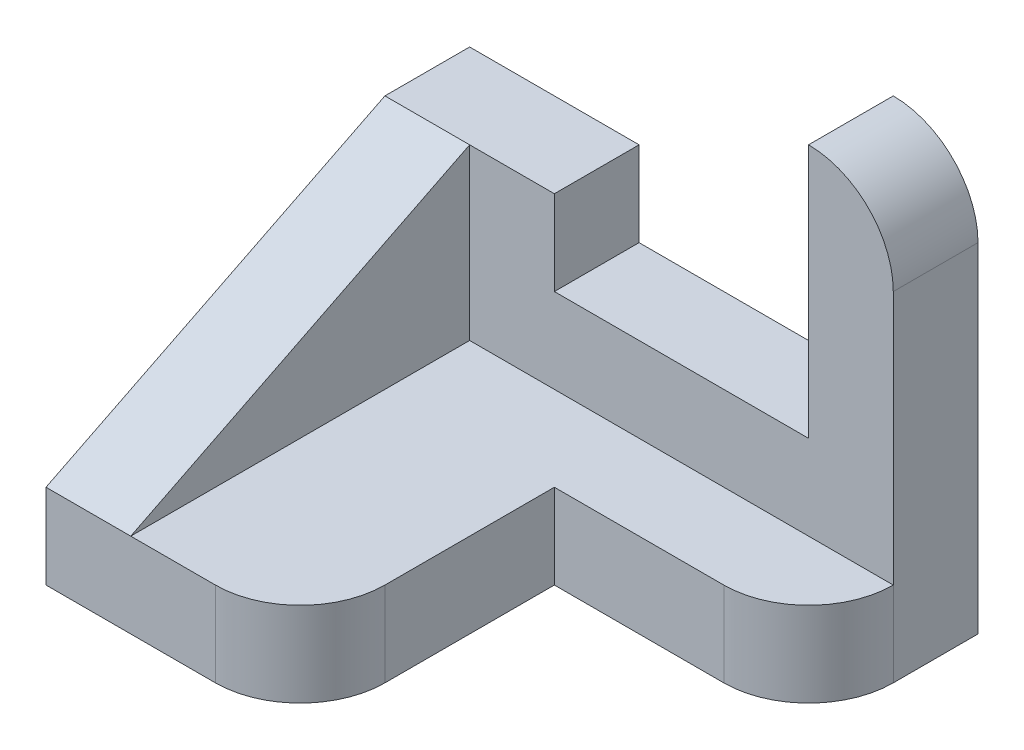
ISO-10303-21;
HEADER;
FILE_DESCRIPTION(('STEP AP214'),'2;1');
FILE_NAME('part.step','',(''),(''),'','','');
FILE_SCHEMA(('AUTOMOTIVE_DESIGN { 1 0 10303 214 1 1 1 1 }'));
ENDSEC;
DATA;
#1=APPLICATION_CONTEXT('core data for automotive mechanical design processes');
#2=APPLICATION_PROTOCOL_DEFINITION('international standard','automotive_design',2000,#1);
#3=PRODUCT_CONTEXT('',#1,'mechanical');
#4=PRODUCT('Part','Part','',(#3));
#5=PRODUCT_RELATED_PRODUCT_CATEGORY('part','',(#4));
#6=PRODUCT_DEFINITION_FORMATION('','',#4);
#7=PRODUCT_DEFINITION_CONTEXT('part definition',#1,'design');
#8=PRODUCT_DEFINITION('design','',#6,#7);
#9=PRODUCT_DEFINITION_SHAPE('','',#8);
#10=(LENGTH_UNIT() NAMED_UNIT(*) SI_UNIT(.MILLI.,.METRE.));
#11=(NAMED_UNIT(*) PLANE_ANGLE_UNIT() SI_UNIT($,.RADIAN.));
#12=(NAMED_UNIT(*) SI_UNIT($,.STERADIAN.) SOLID_ANGLE_UNIT());
#13=UNCERTAINTY_MEASURE_WITH_UNIT(LENGTH_MEASURE(1.E-05),#10,'distance_accuracy_value','');
#14=(GEOMETRIC_REPRESENTATION_CONTEXT(3) GLOBAL_UNCERTAINTY_ASSIGNED_CONTEXT((#13)) GLOBAL_UNIT_ASSIGNED_CONTEXT((#10,
#11,#12)) REPRESENTATION_CONTEXT('',''));
#15=CARTESIAN_POINT('',(0.,0.,0.));
#16=DIRECTION('',(0.,0.,1.));
#17=DIRECTION('',(1.,0.,0.));
#18=AXIS2_PLACEMENT_3D('',#15,#16,#17);
#19=CARTESIAN_POINT('',(-9.99999999999997,10.,15.));
#20=DIRECTION('',(0.,1.,0.));
#21=DIRECTION('',(0.,0.,1.));
#22=AXIS2_PLACEMENT_3D('',#19,#20,#21);
#23=PLANE('',#22);
#24=DIRECTION('',(-1.,0.,0.));
#25=VECTOR('',#24,1.);
#26=CARTESIAN_POINT('',(30.,10.,-15.));
#27=LINE('',#26,#25);
#28=CARTESIAN_POINT('',(30.,10.,-15.));
#29=VERTEX_POINT('',#28);
#30=CARTESIAN_POINT('',(-20.,10.,-15.));
#31=VERTEX_POINT('',#30);
#32=EDGE_CURVE('E185',#29,#31,#27,.T.);
#33=ORIENTED_EDGE('',*,*,#32,.T.);
#34=DIRECTION('',(0.,0.,1.));
#35=VECTOR('',#34,1.);
#36=CARTESIAN_POINT('',(-20.,10.,-15.));
#37=LINE('',#36,#35);
#38=CARTESIAN_POINT('',(-20.,10.,25.));
#39=VERTEX_POINT('',#38);
#40=EDGE_CURVE('E55',#31,#39,#37,.T.);
#41=ORIENTED_EDGE('',*,*,#40,.T.);
#42=DIRECTION('',(1.,0.,0.));
#43=VECTOR('',#42,1.);
#44=CARTESIAN_POINT('',(-30.,10.,25.));
#45=LINE('',#44,#43);
#46=CARTESIAN_POINT('',(-10.,10.,25.));
#47=VERTEX_POINT('',#46);
#48=EDGE_CURVE('E251',#39,#47,#45,.T.);
#49=ORIENTED_EDGE('',*,*,#48,.T.);
#50=CARTESIAN_POINT('',(-9.99999999999997,10.,15.));
#51=DIRECTION('',(0.,1.,0.));
#52=DIRECTION('',(0.,0.,1.));
#53=AXIS2_PLACEMENT_3D('',#50,#51,#52);
#54=CIRCLE('',#53,10.);
#55=CARTESIAN_POINT('',(0.,10.,15.));
#56=VERTEX_POINT('',#55);
#57=EDGE_CURVE('E236',#47,#56,#54,.T.);
#58=ORIENTED_EDGE('',*,*,#57,.T.);
#59=DIRECTION('',(0.,0.,-1.));
#60=VECTOR('',#59,1.);
#61=CARTESIAN_POINT('',(0.,10.,-4.99999999999998));
#62=LINE('',#61,#60);
#63=CARTESIAN_POINT('',(0.,10.,-4.99999999999998));
#64=VERTEX_POINT('',#63);
#65=EDGE_CURVE('E240',#56,#64,#62,.T.);
#66=ORIENTED_EDGE('',*,*,#65,.T.);
#67=DIRECTION('',(1.,0.,0.));
#68=VECTOR('',#67,1.);
#69=CARTESIAN_POINT('',(19.9999999999999,10.,-4.99999999999998));
#70=LINE('',#69,#68);
#71=CARTESIAN_POINT('',(19.9999999999999,10.,-4.99999999999998));
#72=VERTEX_POINT('',#71);
#73=EDGE_CURVE('E244',#64,#72,#70,.T.);
#74=ORIENTED_EDGE('',*,*,#73,.T.);
#75=CARTESIAN_POINT('',(20.,10.,-15.));
#76=DIRECTION('',(0.,1.,0.));
#77=DIRECTION('',(0.,0.,1.));
#78=AXIS2_PLACEMENT_3D('',#75,#76,#77);
#79=CIRCLE('',#78,10.);
#80=EDGE_CURVE('E247',#72,#29,#79,.T.);
#81=ORIENTED_EDGE('',*,*,#80,.T.);
#82=EDGE_LOOP('',(#33,#41,#49,#58,#66,#74,#81));
#83=FACE_BOUND('',#82,.T.);
#84=ADVANCED_FACE('F39',(#83),#23,.T.);
#85=CARTESIAN_POINT('',(20.,40.,-15.));
#86=DIRECTION('',(0.,0.,1.));
#87=DIRECTION('',(1.,0.,0.));
#88=AXIS2_PLACEMENT_3D('',#85,#86,#87);
#89=PLANE('',#88);
#90=DIRECTION('',(-1.,0.,0.));
#91=VECTOR('',#90,1.);
#92=CARTESIAN_POINT('',(-9.99999999999999,30.,-15.));
#93=LINE('',#92,#91);
#94=CARTESIAN_POINT('',(-9.99999999999999,30.,-15.));
#95=VERTEX_POINT('',#94);
#96=CARTESIAN_POINT('',(-20.,30.,-15.));
#97=VERTEX_POINT('',#96);
#98=EDGE_CURVE('E182',#95,#97,#93,.T.);
#99=ORIENTED_EDGE('',*,*,#98,.T.);
#100=DIRECTION('',(0.,-1.,0.));
#101=VECTOR('',#100,1.);
#102=CARTESIAN_POINT('',(-20.,30.,-15.));
#103=LINE('',#102,#101);
#104=EDGE_CURVE('E63',#97,#31,#103,.T.);
#105=ORIENTED_EDGE('',*,*,#104,.T.);
#106=ORIENTED_EDGE('',*,*,#32,.F.);
#107=DIRECTION('',(0.,1.,0.));
#108=VECTOR('',#107,1.);
#109=CARTESIAN_POINT('',(30.,10.,-15.));
#110=LINE('',#109,#108);
#111=CARTESIAN_POINT('',(30.,39.9999999999999,-15.));
#112=VERTEX_POINT('',#111);
#113=EDGE_CURVE('E189',#29,#112,#110,.T.);
#114=ORIENTED_EDGE('',*,*,#113,.T.);
#115=CARTESIAN_POINT('',(20.,40.,-15.));
#116=DIRECTION('',(0.,0.,1.));
#117=DIRECTION('',(1.,0.,0.));
#118=AXIS2_PLACEMENT_3D('',#115,#116,#117);
#119=CIRCLE('',#118,10.);
#120=CARTESIAN_POINT('',(19.9999999999999,50.,-15.));
#121=VERTEX_POINT('',#120);
#122=EDGE_CURVE('E192',#112,#121,#119,.T.);
#123=ORIENTED_EDGE('',*,*,#122,.T.);
#124=DIRECTION('',(0.,1.,0.));
#125=VECTOR('',#124,1.);
#126=CARTESIAN_POINT('',(20.,20.,-15.));
#127=LINE('',#126,#125);
#128=CARTESIAN_POINT('',(20.,20.,-15.));
#129=VERTEX_POINT('',#128);
#130=EDGE_CURVE('E195',#129,#121,#127,.T.);
#131=ORIENTED_EDGE('',*,*,#130,.F.);
#132=DIRECTION('',(-1.,0.,0.));
#133=VECTOR('',#132,1.);
#134=CARTESIAN_POINT('',(20.,20.,-15.));
#135=LINE('',#134,#133);
#136=CARTESIAN_POINT('',(-9.99999999999999,20.,-15.));
#137=VERTEX_POINT('',#136);
#138=EDGE_CURVE('E199',#129,#137,#135,.T.);
#139=ORIENTED_EDGE('',*,*,#138,.T.);
#140=DIRECTION('',(0.,1.,0.));
#141=VECTOR('',#140,1.);
#142=CARTESIAN_POINT('',(-9.99999999999999,20.,-15.));
#143=LINE('',#142,#141);
#144=EDGE_CURVE('E202',#137,#95,#143,.T.);
#145=ORIENTED_EDGE('',*,*,#144,.T.);
#146=EDGE_LOOP('',(#99,#105,#106,#114,#123,#131,#139,#145));
#147=FACE_BOUND('',#146,.T.);
#148=ADVANCED_FACE('F321',(#147),#89,.T.);
#149=CARTESIAN_POINT('',(-9.99999999999997,10.,15.));
#150=DIRECTION('',(0.,-1.,0.));
#151=DIRECTION('',(0.,0.,-1.));
#152=AXIS2_PLACEMENT_3D('',#149,#150,#151);
#153=CYLINDRICAL_SURFACE('',#152,10.);
#154=CARTESIAN_POINT('',(-9.99999999999997,0.,15.));
#155=DIRECTION('',(0.,1.,0.));
#156=DIRECTION('',(0.,0.,1.));
#157=AXIS2_PLACEMENT_3D('',#154,#155,#156);
#158=CIRCLE('',#157,10.);
#159=CARTESIAN_POINT('',(-10.,0.,25.));
#160=VERTEX_POINT('',#159);
#161=CARTESIAN_POINT('',(0.,0.,15.));
#162=VERTEX_POINT('',#161);
#163=EDGE_CURVE('E158',#160,#162,#158,.T.);
#164=ORIENTED_EDGE('',*,*,#163,.T.);
#165=DIRECTION('',(0.,-1.,0.));
#166=VECTOR('',#165,1.);
#167=CARTESIAN_POINT('',(0.,10.,15.));
#168=LINE('',#167,#166);
#169=EDGE_CURVE('E11',#56,#162,#168,.T.);
#170=ORIENTED_EDGE('',*,*,#169,.F.);
#171=ORIENTED_EDGE('',*,*,#57,.F.);
#172=DIRECTION('',(0.,-1.,0.));
#173=VECTOR('',#172,1.);
#174=CARTESIAN_POINT('',(-10.,10.,25.));
#175=LINE('',#174,#173);
#176=EDGE_CURVE('E255',#47,#160,#175,.T.);
#177=ORIENTED_EDGE('',*,*,#176,.T.);
#178=EDGE_LOOP('',(#164,#170,#171,#177));
#179=FACE_BOUND('',#178,.T.);
#180=ADVANCED_FACE('F41',(#179),#153,.T.);
#181=CARTESIAN_POINT('',(0.,10.,-4.99999999999998));
#182=DIRECTION('',(-1.,0.,0.));
#183=DIRECTION('',(0.,0.,1.));
#184=AXIS2_PLACEMENT_3D('',#181,#182,#183);
#185=PLANE('',#184);
#186=DIRECTION('',(0.,0.,-1.));
#187=VECTOR('',#186,1.);
#188=CARTESIAN_POINT('',(0.,0.,-4.99999999999998));
#189=LINE('',#188,#187);
#190=CARTESIAN_POINT('',(0.,0.,-4.99999999999998));
#191=VERTEX_POINT('',#190);
#192=EDGE_CURVE('E259',#162,#191,#189,.T.);
#193=ORIENTED_EDGE('',*,*,#192,.T.);
#194=DIRECTION('',(0.,-1.,0.));
#195=VECTOR('',#194,1.);
#196=CARTESIAN_POINT('',(0.,10.,-4.99999999999998));
#197=LINE('',#196,#195);
#198=EDGE_CURVE('E48',#64,#191,#197,.T.);
#199=ORIENTED_EDGE('',*,*,#198,.F.);
#200=ORIENTED_EDGE('',*,*,#65,.F.);
#201=ORIENTED_EDGE('',*,*,#169,.T.);
#202=EDGE_LOOP('',(#193,#199,#200,#201));
#203=FACE_BOUND('',#202,.T.);
#204=ADVANCED_FACE('F324',(#203),#185,.F.);
#205=CARTESIAN_POINT('',(19.9999999999999,10.,-4.99999999999998));
#206=DIRECTION('',(0.,0.,-1.));
#207=DIRECTION('',(-1.,0.,0.));
#208=AXIS2_PLACEMENT_3D('',#205,#206,#207);
#209=PLANE('',#208);
#210=DIRECTION('',(1.,0.,0.));
#211=VECTOR('',#210,1.);
#212=CARTESIAN_POINT('',(19.9999999999999,0.,-4.99999999999998));
#213=LINE('',#212,#211);
#214=CARTESIAN_POINT('',(19.9999999999999,0.,-4.99999999999998));
#215=VERTEX_POINT('',#214);
#216=EDGE_CURVE('E262',#191,#215,#213,.T.);
#217=ORIENTED_EDGE('',*,*,#216,.T.);
#218=DIRECTION('',(0.,-1.,0.));
#219=VECTOR('',#218,1.);
#220=CARTESIAN_POINT('',(19.9999999999999,10.,-4.99999999999998));
#221=LINE('',#220,#219);
#222=EDGE_CURVE('E295',#72,#215,#221,.T.);
#223=ORIENTED_EDGE('',*,*,#222,.F.);
#224=ORIENTED_EDGE('',*,*,#73,.F.);
#225=ORIENTED_EDGE('',*,*,#198,.T.);
#226=EDGE_LOOP('',(#217,#223,#224,#225));
#227=FACE_BOUND('',#226,.T.);
#228=ADVANCED_FACE('F304',(#227),#209,.F.);
#229=CARTESIAN_POINT('',(20.,10.,-15.));
#230=DIRECTION('',(0.,-1.,0.));
#231=DIRECTION('',(0.,0.,-1.));
#232=AXIS2_PLACEMENT_3D('',#229,#230,#231);
#233=CYLINDRICAL_SURFACE('',#232,10.);
#234=CARTESIAN_POINT('',(20.,0.,-15.));
#235=DIRECTION('',(0.,1.,0.));
#236=DIRECTION('',(0.,0.,1.));
#237=AXIS2_PLACEMENT_3D('',#234,#235,#236);
#238=CIRCLE('',#237,10.);
#239=CARTESIAN_POINT('',(30.,0.,-15.0000000000001));
#240=VERTEX_POINT('',#239);
#241=EDGE_CURVE('E265',#215,#240,#238,.T.);
#242=ORIENTED_EDGE('',*,*,#241,.T.);
#243=DIRECTION('',(0.,-1.,0.));
#244=VECTOR('',#243,1.);
#245=CARTESIAN_POINT('',(30.,10.,-15.0000000000001));
#246=LINE('',#245,#244);
#247=EDGE_CURVE('E291',#29,#240,#246,.T.);
#248=ORIENTED_EDGE('',*,*,#247,.F.);
#249=ORIENTED_EDGE('',*,*,#80,.F.);
#250=ORIENTED_EDGE('',*,*,#222,.T.);
#251=EDGE_LOOP('',(#242,#248,#249,#250));
#252=FACE_BOUND('',#251,.T.);
#253=ADVANCED_FACE('F315',(#252),#233,.T.);
#254=CARTESIAN_POINT('',(30.,10.,-25.));
#255=DIRECTION('',(-1.,0.,0.));
#256=DIRECTION('',(0.,0.,1.));
#257=AXIS2_PLACEMENT_3D('',#254,#255,#256);
#258=PLANE('',#257);
#259=DIRECTION('',(0.,0.,-1.));
#260=VECTOR('',#259,1.);
#261=CARTESIAN_POINT('',(30.,0.,-25.));
#262=LINE('',#261,#260);
#263=CARTESIAN_POINT('',(30.,0.,-25.));
#264=VERTEX_POINT('',#263);
#265=EDGE_CURVE('E268',#240,#264,#262,.T.);
#266=ORIENTED_EDGE('',*,*,#265,.T.);
#267=DIRECTION('',(0.,-1.,0.));
#268=VECTOR('',#267,1.);
#269=CARTESIAN_POINT('',(30.,10.,-25.));
#270=LINE('',#269,#268);
#271=CARTESIAN_POINT('',(30.,39.9999999999999,-25.));
#272=VERTEX_POINT('',#271);
#273=EDGE_CURVE('E287',#272,#264,#270,.T.);
#274=ORIENTED_EDGE('',*,*,#273,.F.);
#275=DIRECTION('',(0.,0.,-1.));
#276=VECTOR('',#275,1.);
#277=CARTESIAN_POINT('',(30.,39.9999999999999,-15.));
#278=LINE('',#277,#276);
#279=EDGE_CURVE('E159',#112,#272,#278,.T.);
#280=ORIENTED_EDGE('',*,*,#279,.F.);
#281=ORIENTED_EDGE('',*,*,#113,.F.);
#282=ORIENTED_EDGE('',*,*,#247,.T.);
#283=EDGE_LOOP('',(#266,#274,#280,#281,#282));
#284=FACE_BOUND('',#283,.T.);
#285=ADVANCED_FACE('F318',(#284),#258,.F.);
#286=CARTESIAN_POINT('',(-30.,10.,-25.));
#287=DIRECTION('',(0.,0.,1.));
#288=DIRECTION('',(1.,0.,0.));
#289=AXIS2_PLACEMENT_3D('',#286,#287,#288);
#290=PLANE('',#289);
#291=DIRECTION('',(-1.,0.,0.));
#292=VECTOR('',#291,1.);
#293=CARTESIAN_POINT('',(-30.,0.,-25.));
#294=LINE('',#293,#292);
#295=CARTESIAN_POINT('',(-30.,0.,-25.));
#296=VERTEX_POINT('',#295);
#297=EDGE_CURVE('E271',#264,#296,#294,.T.);
#298=ORIENTED_EDGE('',*,*,#297,.T.);
#299=DIRECTION('',(0.,-1.,0.));
#300=VECTOR('',#299,1.);
#301=CARTESIAN_POINT('',(-30.,10.,-25.));
#302=LINE('',#301,#300);
#303=CARTESIAN_POINT('',(-30.,30.,-25.));
#304=VERTEX_POINT('',#303);
#305=EDGE_CURVE('E284',#304,#296,#302,.T.);
#306=ORIENTED_EDGE('',*,*,#305,.F.);
#307=DIRECTION('',(-1.,0.,0.));
#308=VECTOR('',#307,1.);
#309=CARTESIAN_POINT('',(-9.99999999999999,30.,-25.));
#310=LINE('',#309,#308);
#311=CARTESIAN_POINT('',(-9.99999999999999,30.,-25.));
#312=VERTEX_POINT('',#311);
#313=EDGE_CURVE('E153',#312,#304,#310,.T.);
#314=ORIENTED_EDGE('',*,*,#313,.F.);
#315=DIRECTION('',(0.,1.,0.));
#316=VECTOR('',#315,1.);
#317=CARTESIAN_POINT('',(-9.99999999999999,20.,-25.));
#318=LINE('',#317,#316);
#319=CARTESIAN_POINT('',(-9.99999999999999,20.,-25.));
#320=VERTEX_POINT('',#319);
#321=EDGE_CURVE('E186',#320,#312,#318,.T.);
#322=ORIENTED_EDGE('',*,*,#321,.F.);
#323=DIRECTION('',(-1.,0.,0.));
#324=VECTOR('',#323,1.);
#325=CARTESIAN_POINT('',(20.,20.,-25.));
#326=LINE('',#325,#324);
#327=CARTESIAN_POINT('',(20.,20.,-25.));
#328=VERTEX_POINT('',#327);
#329=EDGE_CURVE('E216',#328,#320,#326,.T.);
#330=ORIENTED_EDGE('',*,*,#329,.F.);
#331=DIRECTION('',(0.,1.,0.));
#332=VECTOR('',#331,1.);
#333=CARTESIAN_POINT('',(20.,20.,-25.));
#334=LINE('',#333,#332);
#335=CARTESIAN_POINT('',(19.9999999999999,50.,-25.));
#336=VERTEX_POINT('',#335);
#337=EDGE_CURVE('E212',#328,#336,#334,.T.);
#338=ORIENTED_EDGE('',*,*,#337,.T.);
#339=CARTESIAN_POINT('',(20.,40.,-25.));
#340=DIRECTION('',(0.,0.,1.));
#341=DIRECTION('',(1.,0.,0.));
#342=AXIS2_PLACEMENT_3D('',#339,#340,#341);
#343=CIRCLE('',#342,10.);
#344=EDGE_CURVE('E208',#272,#336,#343,.T.);
#345=ORIENTED_EDGE('',*,*,#344,.F.);
#346=ORIENTED_EDGE('',*,*,#273,.T.);
#347=EDGE_LOOP('',(#298,#306,#314,#322,#330,#338,#345,#346));
#348=FACE_BOUND('',#347,.T.);
#349=ADVANCED_FACE('F358',(#348),#290,.F.);
#350=CARTESIAN_POINT('',(-30.,10.,-25.));
#351=DIRECTION('',(1.,0.,0.));
#352=DIRECTION('',(0.,0.,-1.));
#353=AXIS2_PLACEMENT_3D('',#350,#351,#352);
#354=PLANE('',#353);
#355=DIRECTION('',(0.,-1.,0.));
#356=VECTOR('',#355,1.);
#357=CARTESIAN_POINT('',(-30.,10.,25.));
#358=LINE('',#357,#356);
#359=CARTESIAN_POINT('',(-30.,10.,25.));
#360=VERTEX_POINT('',#359);
#361=CARTESIAN_POINT('',(-30.,0.,25.));
#362=VERTEX_POINT('',#361);
#363=EDGE_CURVE('E173',#360,#362,#358,.T.);
#364=ORIENTED_EDGE('',*,*,#363,.F.);
#365=DIRECTION('',(0.,0.447213595499958,-0.894427190999916));
#366=VECTOR('',#365,1.);
#367=CARTESIAN_POINT('',(-30.,30.,-15.));
#368=LINE('',#367,#366);
#369=CARTESIAN_POINT('',(-30.,30.,-15.));
#370=VERTEX_POINT('',#369);
#371=EDGE_CURVE('E166',#360,#370,#368,.T.);
#372=ORIENTED_EDGE('',*,*,#371,.T.);
#373=DIRECTION('',(0.,0.,-1.));
#374=VECTOR('',#373,1.);
#375=CARTESIAN_POINT('',(-30.,30.,-15.));
#376=LINE('',#375,#374);
#377=EDGE_CURVE('E146',#370,#304,#376,.T.);
#378=ORIENTED_EDGE('',*,*,#377,.T.);
#379=ORIENTED_EDGE('',*,*,#305,.T.);
#380=DIRECTION('',(0.,0.,1.));
#381=VECTOR('',#380,1.);
#382=CARTESIAN_POINT('',(-30.,0.,-25.));
#383=LINE('',#382,#381);
#384=EDGE_CURVE('E274',#296,#362,#383,.T.);
#385=ORIENTED_EDGE('',*,*,#384,.T.);
#386=EDGE_LOOP('',(#364,#372,#378,#379,#385));
#387=FACE_BOUND('',#386,.T.);
#388=ADVANCED_FACE('F171',(#387),#354,.F.);
#389=CARTESIAN_POINT('',(-30.,10.,25.));
#390=DIRECTION('',(0.,0.,-1.));
#391=DIRECTION('',(-1.,0.,0.));
#392=AXIS2_PLACEMENT_3D('',#389,#390,#391);
#393=PLANE('',#392);
#394=DIRECTION('',(1.,0.,0.));
#395=VECTOR('',#394,1.);
#396=CARTESIAN_POINT('',(-30.,0.,25.));
#397=LINE('',#396,#395);
#398=EDGE_CURVE('E241',#362,#160,#397,.T.);
#399=ORIENTED_EDGE('',*,*,#398,.T.);
#400=ORIENTED_EDGE('',*,*,#176,.F.);
#401=ORIENTED_EDGE('',*,*,#48,.F.);
#402=EDGE_CURVE('E252',#360,#39,#45,.T.);
#403=ORIENTED_EDGE('',*,*,#402,.F.);
#404=ORIENTED_EDGE('',*,*,#363,.T.);
#405=EDGE_LOOP('',(#399,#400,#401,#403,#404));
#406=FACE_BOUND('',#405,.T.);
#407=ADVANCED_FACE('F330',(#406),#393,.F.);
#408=CARTESIAN_POINT('',(-9.99999999999997,0.,15.));
#409=DIRECTION('',(0.,1.,0.));
#410=DIRECTION('',(0.,0.,1.));
#411=AXIS2_PLACEMENT_3D('',#408,#409,#410);
#412=PLANE('',#411);
#413=ORIENTED_EDGE('',*,*,#163,.F.);
#414=ORIENTED_EDGE('',*,*,#398,.F.);
#415=ORIENTED_EDGE('',*,*,#384,.F.);
#416=ORIENTED_EDGE('',*,*,#297,.F.);
#417=ORIENTED_EDGE('',*,*,#265,.F.);
#418=ORIENTED_EDGE('',*,*,#241,.F.);
#419=ORIENTED_EDGE('',*,*,#216,.F.);
#420=ORIENTED_EDGE('',*,*,#192,.F.);
#421=EDGE_LOOP('',(#413,#414,#415,#416,#417,#418,#419,#420));
#422=FACE_BOUND('',#421,.T.);
#423=ADVANCED_FACE('F310',(#422),#412,.F.);
#424=CARTESIAN_POINT('',(-9.99999999999999,30.,-15.));
#425=DIRECTION('',(0.,-1.,0.));
#426=DIRECTION('',(0.,0.,-1.));
#427=AXIS2_PLACEMENT_3D('',#424,#425,#426);
#428=PLANE('',#427);
#429=ORIENTED_EDGE('',*,*,#313,.T.);
#430=ORIENTED_EDGE('',*,*,#377,.F.);
#431=DIRECTION('',(-1.,0.,0.));
#432=VECTOR('',#431,1.);
#433=CARTESIAN_POINT('',(-20.,30.,-15.));
#434=LINE('',#433,#432);
#435=EDGE_CURVE('E150',#97,#370,#434,.T.);
#436=ORIENTED_EDGE('',*,*,#435,.F.);
#437=ORIENTED_EDGE('',*,*,#98,.F.);
#438=DIRECTION('',(0.,0.,-1.));
#439=VECTOR('',#438,1.);
#440=CARTESIAN_POINT('',(-9.99999999999999,30.,-15.));
#441=LINE('',#440,#439);
#442=EDGE_CURVE('E205',#95,#312,#441,.T.);
#443=ORIENTED_EDGE('',*,*,#442,.T.);
#444=EDGE_LOOP('',(#429,#430,#436,#437,#443));
#445=FACE_BOUND('',#444,.T.);
#446=ADVANCED_FACE('F148',(#445),#428,.F.);
#447=CARTESIAN_POINT('',(20.,40.,-15.));
#448=DIRECTION('',(0.,0.,-1.));
#449=DIRECTION('',(-1.,0.,0.));
#450=AXIS2_PLACEMENT_3D('',#447,#448,#449);
#451=CYLINDRICAL_SURFACE('',#450,10.);
#452=ORIENTED_EDGE('',*,*,#344,.T.);
#453=DIRECTION('',(0.,0.,-1.));
#454=VECTOR('',#453,1.);
#455=CARTESIAN_POINT('',(19.9999999999999,50.,-15.));
#456=LINE('',#455,#454);
#457=EDGE_CURVE('E230',#121,#336,#456,.T.);
#458=ORIENTED_EDGE('',*,*,#457,.F.);
#459=ORIENTED_EDGE('',*,*,#122,.F.);
#460=ORIENTED_EDGE('',*,*,#279,.T.);
#461=EDGE_LOOP('',(#452,#458,#459,#460));
#462=FACE_BOUND('',#461,.T.);
#463=ADVANCED_FACE('F406',(#462),#451,.T.);
#464=CARTESIAN_POINT('',(20.,20.,-15.));
#465=DIRECTION('',(-1.,0.,0.));
#466=DIRECTION('',(0.,-1.,0.));
#467=AXIS2_PLACEMENT_3D('',#464,#465,#466);
#468=PLANE('',#467);
#469=ORIENTED_EDGE('',*,*,#337,.F.);
#470=DIRECTION('',(0.,0.,-1.));
#471=VECTOR('',#470,1.);
#472=CARTESIAN_POINT('',(20.,20.,-15.));
#473=LINE('',#472,#471);
#474=EDGE_CURVE('E227',#129,#328,#473,.T.);
#475=ORIENTED_EDGE('',*,*,#474,.F.);
#476=ORIENTED_EDGE('',*,*,#130,.T.);
#477=ORIENTED_EDGE('',*,*,#457,.T.);
#478=EDGE_LOOP('',(#469,#475,#476,#477));
#479=FACE_BOUND('',#478,.T.);
#480=ADVANCED_FACE('F430',(#479),#468,.T.);
#481=CARTESIAN_POINT('',(20.,20.,-15.));
#482=DIRECTION('',(0.,-1.,0.));
#483=DIRECTION('',(0.,0.,-1.));
#484=AXIS2_PLACEMENT_3D('',#481,#482,#483);
#485=PLANE('',#484);
#486=ORIENTED_EDGE('',*,*,#329,.T.);
#487=DIRECTION('',(0.,0.,-1.));
#488=VECTOR('',#487,1.);
#489=CARTESIAN_POINT('',(-9.99999999999999,20.,-15.));
#490=LINE('',#489,#488);
#491=EDGE_CURVE('E223',#137,#320,#490,.T.);
#492=ORIENTED_EDGE('',*,*,#491,.F.);
#493=ORIENTED_EDGE('',*,*,#138,.F.);
#494=ORIENTED_EDGE('',*,*,#474,.T.);
#495=EDGE_LOOP('',(#486,#492,#493,#494));
#496=FACE_BOUND('',#495,.T.);
#497=ADVANCED_FACE('F423',(#496),#485,.F.);
#498=CARTESIAN_POINT('',(-9.99999999999999,20.,-15.));
#499=DIRECTION('',(-1.,0.,0.));
#500=DIRECTION('',(0.,0.,1.));
#501=AXIS2_PLACEMENT_3D('',#498,#499,#500);
#502=PLANE('',#501);
#503=ORIENTED_EDGE('',*,*,#321,.T.);
#504=ORIENTED_EDGE('',*,*,#442,.F.);
#505=ORIENTED_EDGE('',*,*,#144,.F.);
#506=ORIENTED_EDGE('',*,*,#491,.T.);
#507=EDGE_LOOP('',(#503,#504,#505,#506));
#508=FACE_BOUND('',#507,.T.);
#509=ADVANCED_FACE('F341',(#508),#502,.F.);
#510=CARTESIAN_POINT('',(-20.,30.,-15.));
#511=DIRECTION('',(0.,0.894427190999916,0.447213595499958));
#512=DIRECTION('',(0.,-0.447213595499958,0.894427190999916));
#513=AXIS2_PLACEMENT_3D('',#510,#511,#512);
#514=PLANE('',#513);
#515=ORIENTED_EDGE('',*,*,#371,.F.);
#516=ORIENTED_EDGE('',*,*,#402,.T.);
#517=DIRECTION('',(0.,0.447213595499958,-0.894427190999916));
#518=VECTOR('',#517,1.);
#519=CARTESIAN_POINT('',(-20.,30.,-15.));
#520=LINE('',#519,#518);
#521=EDGE_CURVE('E168',#39,#97,#520,.T.);
#522=ORIENTED_EDGE('',*,*,#521,.T.);
#523=ORIENTED_EDGE('',*,*,#435,.T.);
#524=EDGE_LOOP('',(#515,#516,#522,#523));
#525=FACE_BOUND('',#524,.T.);
#526=ADVANCED_FACE('F164',(#525),#514,.T.);
#527=CARTESIAN_POINT('',(-20.,0.,0.));
#528=DIRECTION('',(-1.,0.,0.));
#529=DIRECTION('',(0.,0.,1.));
#530=AXIS2_PLACEMENT_3D('',#527,#528,#529);
#531=PLANE('',#530);
#532=ORIENTED_EDGE('',*,*,#104,.F.);
#533=ORIENTED_EDGE('',*,*,#521,.F.);
#534=ORIENTED_EDGE('',*,*,#40,.F.);
#535=EDGE_LOOP('',(#532,#533,#534));
#536=FACE_BOUND('',#535,.T.);
#537=ADVANCED_FACE('F332',(#536),#531,.F.);
#538=CLOSED_SHELL('',(#84,#148,#180,#204,#228,#253,#285,#349,#388,#407,#423,#446,#463,#480,#497,
#509,#526,#537));
#539=MANIFOLD_SOLID_BREP('B2',#538);
#540=ADVANCED_BREP_SHAPE_REPRESENTATION('',(#18,#539),#14);
#541=SHAPE_DEFINITION_REPRESENTATION(#9,#540);
ENDSEC;
END-ISO-10303-21;
